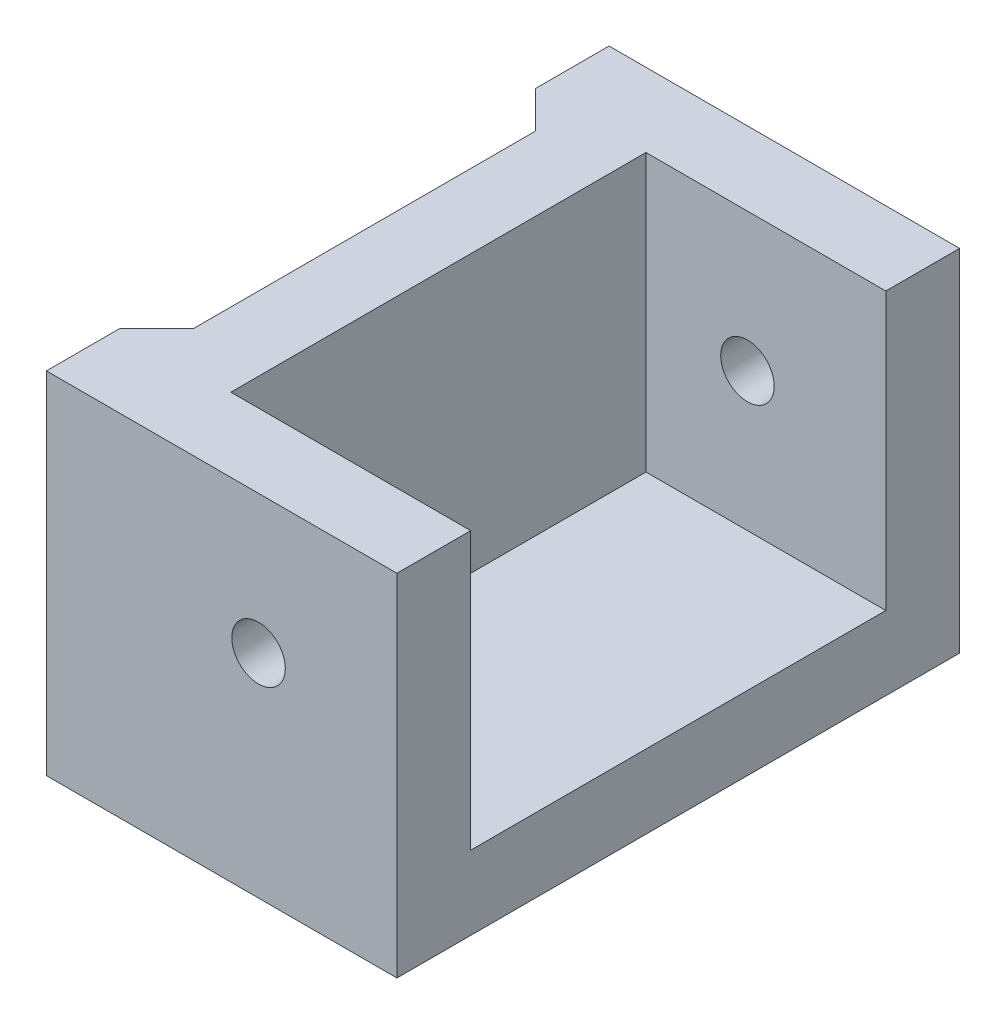
ISO-10303-21;
HEADER;
FILE_DESCRIPTION(('STEP AP214'),'2;1');
FILE_NAME('part.step','',(''),(''),'','','');
FILE_SCHEMA(('AUTOMOTIVE_DESIGN { 1 0 10303 214 1 1 1 1 }'));
ENDSEC;
DATA;
#1=APPLICATION_CONTEXT('core data for automotive mechanical design processes');
#2=APPLICATION_PROTOCOL_DEFINITION('international standard','automotive_design',2000,#1);
#3=PRODUCT_CONTEXT('',#1,'mechanical');
#4=PRODUCT('Part','Part','',(#3));
#5=PRODUCT_RELATED_PRODUCT_CATEGORY('part','',(#4));
#6=PRODUCT_DEFINITION_FORMATION('','',#4);
#7=PRODUCT_DEFINITION_CONTEXT('part definition',#1,'design');
#8=PRODUCT_DEFINITION('design','',#6,#7);
#9=PRODUCT_DEFINITION_SHAPE('','',#8);
#10=(LENGTH_UNIT() NAMED_UNIT(*) SI_UNIT(.MILLI.,.METRE.));
#11=(NAMED_UNIT(*) PLANE_ANGLE_UNIT() SI_UNIT($,.RADIAN.));
#12=(NAMED_UNIT(*) SI_UNIT($,.STERADIAN.) SOLID_ANGLE_UNIT());
#13=UNCERTAINTY_MEASURE_WITH_UNIT(LENGTH_MEASURE(1.E-05),#10,'distance_accuracy_value','');
#14=(GEOMETRIC_REPRESENTATION_CONTEXT(3) GLOBAL_UNCERTAINTY_ASSIGNED_CONTEXT((#13)) GLOBAL_UNIT_ASSIGNED_CONTEXT((#10,
#11,#12)) REPRESENTATION_CONTEXT('',''));
#15=CARTESIAN_POINT('',(0.,0.,0.));
#16=DIRECTION('',(0.,0.,1.));
#17=DIRECTION('',(1.,0.,0.));
#18=AXIS2_PLACEMENT_3D('',#15,#16,#17);
#19=CARTESIAN_POINT('',(5.08,5.08,38.735));
#20=DIRECTION('',(-1.,0.,0.));
#21=DIRECTION('',(0.,0.,1.));
#22=AXIS2_PLACEMENT_3D('',#19,#20,#21);
#23=PLANE('',#22);
#24=DIRECTION('',(0.,-1.,0.));
#25=VECTOR('',#24,1.);
#26=CARTESIAN_POINT('',(5.08,5.08,5.08));
#27=LINE('',#26,#25);
#28=CARTESIAN_POINT('',(5.08,21.59,5.08));
#29=VERTEX_POINT('',#28);
#30=CARTESIAN_POINT('',(5.08,2.54,5.08));
#31=VERTEX_POINT('',#30);
#32=EDGE_CURVE('E122',#29,#31,#27,.T.);
#33=ORIENTED_EDGE('',*,*,#32,.F.);
#34=DIRECTION('',(0.,0.,-1.));
#35=VECTOR('',#34,1.);
#36=CARTESIAN_POINT('',(5.08,21.59,38.735));
#37=LINE('',#36,#35);
#38=CARTESIAN_POINT('',(5.08,21.59,33.655));
#39=VERTEX_POINT('',#38);
#40=EDGE_CURVE('E218',#39,#29,#37,.T.);
#41=ORIENTED_EDGE('',*,*,#40,.F.);
#42=DIRECTION('',(0.,-1.,0.));
#43=VECTOR('',#42,1.);
#44=CARTESIAN_POINT('',(5.08,5.08,33.655));
#45=LINE('',#44,#43);
#46=CARTESIAN_POINT('',(5.08,2.54,33.655));
#47=VERTEX_POINT('',#46);
#48=EDGE_CURVE('E146',#39,#47,#45,.T.);
#49=ORIENTED_EDGE('',*,*,#48,.T.);
#50=DIRECTION('',(0.,0.,-1.));
#51=VECTOR('',#50,1.);
#52=CARTESIAN_POINT('',(5.08,2.54,33.655));
#53=LINE('',#52,#51);
#54=EDGE_CURVE('E140',#47,#31,#53,.T.);
#55=ORIENTED_EDGE('',*,*,#54,.T.);
#56=EDGE_LOOP('',(#33,#41,#49,#55));
#57=FACE_BOUND('',#56,.T.);
#58=ADVANCED_FACE('F33',(#57),#23,.F.);
#59=CARTESIAN_POINT('',(0.,5.08,38.735));
#60=DIRECTION('',(1.,0.,0.));
#61=DIRECTION('',(0.,0.,-1.));
#62=AXIS2_PLACEMENT_3D('',#59,#60,#61);
#63=PLANE('',#62);
#64=DIRECTION('',(0.,0.,1.));
#65=VECTOR('',#64,1.);
#66=CARTESIAN_POINT('',(0.,-2.54,38.735));
#67=LINE('',#66,#65);
#68=CARTESIAN_POINT('',(0.,-2.54,7.62));
#69=VERTEX_POINT('',#68);
#70=CARTESIAN_POINT('',(0.,-2.54,31.115));
#71=VERTEX_POINT('',#70);
#72=EDGE_CURVE('E151',#69,#71,#67,.T.);
#73=ORIENTED_EDGE('',*,*,#72,.T.);
#74=DIRECTION('',(0.,1.,0.));
#75=VECTOR('',#74,1.);
#76=CARTESIAN_POINT('',(0.,5.08,31.115));
#77=LINE('',#76,#75);
#78=CARTESIAN_POINT('',(0.,21.59,31.115));
#79=VERTEX_POINT('',#78);
#80=EDGE_CURVE('E221',#71,#79,#77,.T.);
#81=ORIENTED_EDGE('',*,*,#80,.T.);
#82=DIRECTION('',(0.,0.,-1.));
#83=VECTOR('',#82,1.);
#84=CARTESIAN_POINT('',(0.,21.59,38.735));
#85=LINE('',#84,#83);
#86=CARTESIAN_POINT('',(0.,21.59,7.62));
#87=VERTEX_POINT('',#86);
#88=EDGE_CURVE('E214',#79,#87,#85,.T.);
#89=ORIENTED_EDGE('',*,*,#88,.T.);
#90=DIRECTION('',(0.,-1.,0.));
#91=VECTOR('',#90,1.);
#92=CARTESIAN_POINT('',(0.,-2.54,7.62));
#93=LINE('',#92,#91);
#94=EDGE_CURVE('E55',#87,#69,#93,.T.);
#95=ORIENTED_EDGE('',*,*,#94,.T.);
#96=EDGE_LOOP('',(#73,#81,#89,#95));
#97=FACE_BOUND('',#96,.T.);
#98=ADVANCED_FACE('F232',(#97),#63,.F.);
#99=CARTESIAN_POINT('',(21.59,0.,38.735));
#100=DIRECTION('',(-1.,0.,0.));
#101=DIRECTION('',(0.,0.,1.));
#102=AXIS2_PLACEMENT_3D('',#99,#100,#101);
#103=PLANE('',#102);
#104=DIRECTION('',(0.,-1.,0.));
#105=VECTOR('',#104,1.);
#106=CARTESIAN_POINT('',(21.59,-2.54,5.08));
#107=LINE('',#106,#105);
#108=CARTESIAN_POINT('',(21.59,21.59,5.08));
#109=VERTEX_POINT('',#108);
#110=CARTESIAN_POINT('',(21.59,2.54,5.08));
#111=VERTEX_POINT('',#110);
#112=EDGE_CURVE('E165',#109,#111,#107,.T.);
#113=ORIENTED_EDGE('',*,*,#112,.T.);
#114=DIRECTION('',(0.,0.,-1.));
#115=VECTOR('',#114,1.);
#116=CARTESIAN_POINT('',(21.59,2.54,33.655));
#117=LINE('',#116,#115);
#118=CARTESIAN_POINT('',(21.59,2.54,33.655));
#119=VERTEX_POINT('',#118);
#120=EDGE_CURVE('E143',#119,#111,#117,.T.);
#121=ORIENTED_EDGE('',*,*,#120,.F.);
#122=DIRECTION('',(0.,1.,0.));
#123=VECTOR('',#122,1.);
#124=CARTESIAN_POINT('',(21.59,-2.54,33.655));
#125=LINE('',#124,#123);
#126=CARTESIAN_POINT('',(21.59,21.59,33.655));
#127=VERTEX_POINT('',#126);
#128=EDGE_CURVE('E187',#119,#127,#125,.T.);
#129=ORIENTED_EDGE('',*,*,#128,.T.);
#130=DIRECTION('',(0.,0.,1.));
#131=VECTOR('',#130,1.);
#132=CARTESIAN_POINT('',(21.59,21.59,33.655));
#133=LINE('',#132,#131);
#134=CARTESIAN_POINT('',(21.59,21.59,38.735));
#135=VERTEX_POINT('',#134);
#136=EDGE_CURVE('E200',#127,#135,#133,.T.);
#137=ORIENTED_EDGE('',*,*,#136,.T.);
#138=DIRECTION('',(0.,1.,0.));
#139=VECTOR('',#138,1.);
#140=CARTESIAN_POINT('',(21.59,0.,38.735));
#141=LINE('',#140,#139);
#142=CARTESIAN_POINT('',(21.59,-2.54,38.735));
#143=VERTEX_POINT('',#142);
#144=EDGE_CURVE('E209',#143,#135,#141,.T.);
#145=ORIENTED_EDGE('',*,*,#144,.F.);
#146=DIRECTION('',(0.,0.,1.));
#147=VECTOR('',#146,1.);
#148=CARTESIAN_POINT('',(21.59,-2.54,33.655));
#149=LINE('',#148,#147);
#150=CARTESIAN_POINT('',(21.59,-2.54,0.));
#151=VERTEX_POINT('',#150);
#152=EDGE_CURVE('E203',#151,#143,#149,.T.);
#153=ORIENTED_EDGE('',*,*,#152,.F.);
#154=DIRECTION('',(0.,1.,0.));
#155=VECTOR('',#154,1.);
#156=CARTESIAN_POINT('',(21.59,0.,0.));
#157=LINE('',#156,#155);
#158=CARTESIAN_POINT('',(21.59,21.59,0.));
#159=VERTEX_POINT('',#158);
#160=EDGE_CURVE('E208',#151,#159,#157,.T.);
#161=ORIENTED_EDGE('',*,*,#160,.T.);
#162=DIRECTION('',(0.,0.,-1.));
#163=VECTOR('',#162,1.);
#164=CARTESIAN_POINT('',(21.59,21.59,5.08));
#165=LINE('',#164,#163);
#166=EDGE_CURVE('E173',#109,#159,#165,.T.);
#167=ORIENTED_EDGE('',*,*,#166,.F.);
#168=EDGE_LOOP('',(#113,#121,#129,#137,#145,#153,#161,#167));
#169=FACE_BOUND('',#168,.T.);
#170=ADVANCED_FACE('F249',(#169),#103,.F.);
#171=CARTESIAN_POINT('',(0.,21.59,38.735));
#172=DIRECTION('',(0.,-1.,0.));
#173=DIRECTION('',(0.,0.,-1.));
#174=AXIS2_PLACEMENT_3D('',#171,#172,#173);
#175=PLANE('',#174);
#176=DIRECTION('',(-1.,0.,0.));
#177=VECTOR('',#176,1.);
#178=CARTESIAN_POINT('',(0.,21.59,0.));
#179=LINE('',#178,#177);
#180=CARTESIAN_POINT('',(-2.54,21.59,0.));
#181=VERTEX_POINT('',#180);
#182=EDGE_CURVE('E212',#159,#181,#179,.T.);
#183=ORIENTED_EDGE('',*,*,#182,.T.);
#184=DIRECTION('',(0.,0.,-1.));
#185=VECTOR('',#184,1.);
#186=CARTESIAN_POINT('',(-2.54,21.59,5.08));
#187=LINE('',#186,#185);
#188=CARTESIAN_POINT('',(-2.54,21.59,5.08));
#189=VERTEX_POINT('',#188);
#190=EDGE_CURVE('E167',#189,#181,#187,.T.);
#191=ORIENTED_EDGE('',*,*,#190,.F.);
#192=DIRECTION('',(-0.70710678118655,0.,-0.707106781186545));
#193=VECTOR('',#192,1.);
#194=CARTESIAN_POINT('',(15.5575,21.59,23.1774999999999));
#195=LINE('',#194,#193);
#196=EDGE_CURVE('E41',#189,#87,#195,.F.);
#197=ORIENTED_EDGE('',*,*,#196,.T.);
#198=ORIENTED_EDGE('',*,*,#88,.F.);
#199=DIRECTION('',(-0.707106781186545,0.,0.70710678118655));
#200=VECTOR('',#199,1.);
#201=CARTESIAN_POINT('',(-3.81000000000001,21.59,34.925));
#202=LINE('',#201,#200);
#203=CARTESIAN_POINT('',(-2.54,21.59,33.655));
#204=VERTEX_POINT('',#203);
#205=EDGE_CURVE('E224',#79,#204,#202,.T.);
#206=ORIENTED_EDGE('',*,*,#205,.T.);
#207=DIRECTION('',(0.,0.,1.));
#208=VECTOR('',#207,1.);
#209=CARTESIAN_POINT('',(-2.54,21.59,33.655));
#210=LINE('',#209,#208);
#211=CARTESIAN_POINT('',(-2.54,21.59,38.735));
#212=VERTEX_POINT('',#211);
#213=EDGE_CURVE('E197',#204,#212,#210,.T.);
#214=ORIENTED_EDGE('',*,*,#213,.T.);
#215=DIRECTION('',(-1.,0.,0.));
#216=VECTOR('',#215,1.);
#217=CARTESIAN_POINT('',(0.,21.59,38.735));
#218=LINE('',#217,#216);
#219=EDGE_CURVE('E211',#135,#212,#218,.T.);
#220=ORIENTED_EDGE('',*,*,#219,.F.);
#221=ORIENTED_EDGE('',*,*,#136,.F.);
#222=DIRECTION('',(-1.,0.,0.));
#223=VECTOR('',#222,1.);
#224=CARTESIAN_POINT('',(-2.54,21.59,33.655));
#225=LINE('',#224,#223);
#226=EDGE_CURVE('E190',#127,#39,#225,.T.);
#227=ORIENTED_EDGE('',*,*,#226,.T.);
#228=ORIENTED_EDGE('',*,*,#40,.T.);
#229=DIRECTION('',(1.,0.,0.));
#230=VECTOR('',#229,1.);
#231=CARTESIAN_POINT('',(-2.54,21.59,5.08));
#232=LINE('',#231,#230);
#233=EDGE_CURVE('E128',#29,#109,#232,.T.);
#234=ORIENTED_EDGE('',*,*,#233,.T.);
#235=ORIENTED_EDGE('',*,*,#166,.T.);
#236=EDGE_LOOP('',(#183,#191,#197,#198,#206,#214,#220,#221,#227,#228,#234,#235));
#237=FACE_BOUND('',#236,.T.);
#238=ADVANCED_FACE('F229',(#237),#175,.F.);
#239=CARTESIAN_POINT('',(0.,0.,38.735));
#240=DIRECTION('',(0.,0.,-1.));
#241=DIRECTION('',(-1.,0.,0.));
#242=AXIS2_PLACEMENT_3D('',#239,#240,#241);
#243=PLANE('',#242);
#244=ORIENTED_EDGE('',*,*,#144,.T.);
#245=ORIENTED_EDGE('',*,*,#219,.T.);
#246=DIRECTION('',(0.,-1.,0.));
#247=VECTOR('',#246,1.);
#248=CARTESIAN_POINT('',(-2.54,-2.54,38.735));
#249=LINE('',#248,#247);
#250=CARTESIAN_POINT('',(-2.54,-2.54,38.735));
#251=VERTEX_POINT('',#250);
#252=EDGE_CURVE('E181',#212,#251,#249,.T.);
#253=ORIENTED_EDGE('',*,*,#252,.T.);
#254=DIRECTION('',(1.,0.,0.));
#255=VECTOR('',#254,1.);
#256=CARTESIAN_POINT('',(-2.54,-2.54,38.735));
#257=LINE('',#256,#255);
#258=EDGE_CURVE('E188',#251,#143,#257,.T.);
#259=ORIENTED_EDGE('',*,*,#258,.T.);
#260=EDGE_LOOP('',(#244,#245,#253,#259));
#261=FACE_BOUND('',#260,.T.);
#262=CARTESIAN_POINT('',(12.065,12.065,38.735));
#263=DIRECTION('',(0.,0.,1.));
#264=DIRECTION('',(1.,0.,0.));
#265=AXIS2_PLACEMENT_3D('',#262,#263,#264);
#266=CIRCLE('',#265,1.8415);
#267=CARTESIAN_POINT('',(13.9065,12.065,38.735));
#268=VERTEX_POINT('',#267);
#269=EDGE_CURVE('E133',#268,#268,#266,.T.);
#270=ORIENTED_EDGE('',*,*,#269,.F.);
#271=EDGE_LOOP('',(#270));
#272=FACE_BOUND('',#271,.T.);
#273=ADVANCED_FACE('F254',(#261,#272),#243,.F.);
#274=CARTESIAN_POINT('',(0.,0.,0.));
#275=DIRECTION('',(0.,0.,-1.));
#276=DIRECTION('',(-1.,0.,0.));
#277=AXIS2_PLACEMENT_3D('',#274,#275,#276);
#278=PLANE('',#277);
#279=ORIENTED_EDGE('',*,*,#182,.F.);
#280=ORIENTED_EDGE('',*,*,#160,.F.);
#281=DIRECTION('',(-1.,0.,0.));
#282=VECTOR('',#281,1.);
#283=CARTESIAN_POINT('',(-2.54,-2.54,0.));
#284=LINE('',#283,#282);
#285=CARTESIAN_POINT('',(-2.54,-2.54,0.));
#286=VERTEX_POINT('',#285);
#287=EDGE_CURVE('E163',#151,#286,#284,.T.);
#288=ORIENTED_EDGE('',*,*,#287,.T.);
#289=DIRECTION('',(0.,1.,0.));
#290=VECTOR('',#289,1.);
#291=CARTESIAN_POINT('',(-2.54,-2.54,0.));
#292=LINE('',#291,#290);
#293=EDGE_CURVE('E157',#286,#181,#292,.T.);
#294=ORIENTED_EDGE('',*,*,#293,.T.);
#295=EDGE_LOOP('',(#279,#280,#288,#294));
#296=FACE_BOUND('',#295,.T.);
#297=CARTESIAN_POINT('',(12.065,12.065,0.));
#298=DIRECTION('',(0.,0.,-1.));
#299=DIRECTION('',(-1.,0.,0.));
#300=AXIS2_PLACEMENT_3D('',#297,#298,#299);
#301=CIRCLE('',#300,1.8415);
#302=CARTESIAN_POINT('',(10.2235,12.065,0.));
#303=VERTEX_POINT('',#302);
#304=EDGE_CURVE('E153',#303,#303,#301,.T.);
#305=ORIENTED_EDGE('',*,*,#304,.F.);
#306=EDGE_LOOP('',(#305));
#307=FACE_BOUND('',#306,.T.);
#308=ADVANCED_FACE('F243',(#296,#307),#278,.T.);
#309=CARTESIAN_POINT('',(-2.54,-2.54,33.655));
#310=DIRECTION('',(0.,-1.,0.));
#311=DIRECTION('',(0.,0.,-1.));
#312=AXIS2_PLACEMENT_3D('',#309,#310,#311);
#313=PLANE('',#312);
#314=ORIENTED_EDGE('',*,*,#152,.T.);
#315=ORIENTED_EDGE('',*,*,#258,.F.);
#316=DIRECTION('',(0.,0.,1.));
#317=VECTOR('',#316,1.);
#318=CARTESIAN_POINT('',(-2.54,-2.54,33.655));
#319=LINE('',#318,#317);
#320=CARTESIAN_POINT('',(-2.54,-2.54,33.655));
#321=VERTEX_POINT('',#320);
#322=EDGE_CURVE('E193',#321,#251,#319,.T.);
#323=ORIENTED_EDGE('',*,*,#322,.F.);
#324=DIRECTION('',(0.707106781186545,0.,-0.70710678118655));
#325=VECTOR('',#324,1.);
#326=CARTESIAN_POINT('',(0.,-2.54,31.115));
#327=LINE('',#326,#325);
#328=EDGE_CURVE('E48',#321,#71,#327,.T.);
#329=ORIENTED_EDGE('',*,*,#328,.T.);
#330=ORIENTED_EDGE('',*,*,#72,.F.);
#331=DIRECTION('',(0.70710678118655,0.,0.707106781186545));
#332=VECTOR('',#331,1.);
#333=CARTESIAN_POINT('',(-2.54000000000002,-2.54,5.08));
#334=LINE('',#333,#332);
#335=CARTESIAN_POINT('',(-2.54,-2.54,5.08));
#336=VERTEX_POINT('',#335);
#337=EDGE_CURVE('E11',#69,#336,#334,.F.);
#338=ORIENTED_EDGE('',*,*,#337,.T.);
#339=DIRECTION('',(0.,0.,-1.));
#340=VECTOR('',#339,1.);
#341=CARTESIAN_POINT('',(-2.54,-2.54,5.08));
#342=LINE('',#341,#340);
#343=EDGE_CURVE('E134',#336,#286,#342,.T.);
#344=ORIENTED_EDGE('',*,*,#343,.T.);
#345=ORIENTED_EDGE('',*,*,#287,.F.);
#346=EDGE_LOOP('',(#314,#315,#323,#329,#330,#338,#344,#345));
#347=FACE_BOUND('',#346,.T.);
#348=ADVANCED_FACE('F236',(#347),#313,.T.);
#349=CARTESIAN_POINT('',(-2.54,-2.54,33.655));
#350=DIRECTION('',(-1.,0.,0.));
#351=DIRECTION('',(0.,0.,1.));
#352=AXIS2_PLACEMENT_3D('',#349,#350,#351);
#353=PLANE('',#352);
#354=ORIENTED_EDGE('',*,*,#252,.F.);
#355=ORIENTED_EDGE('',*,*,#213,.F.);
#356=DIRECTION('',(0.,-1.,0.));
#357=VECTOR('',#356,1.);
#358=CARTESIAN_POINT('',(-2.54,-2.54,33.655));
#359=LINE('',#358,#357);
#360=EDGE_CURVE('E184',#204,#321,#359,.T.);
#361=ORIENTED_EDGE('',*,*,#360,.T.);
#362=ORIENTED_EDGE('',*,*,#322,.T.);
#363=EDGE_LOOP('',(#354,#355,#361,#362));
#364=FACE_BOUND('',#363,.T.);
#365=ADVANCED_FACE('F261',(#364),#353,.T.);
#366=CARTESIAN_POINT('',(0.,0.,33.655));
#367=DIRECTION('',(0.,0.,-1.));
#368=DIRECTION('',(-1.,0.,0.));
#369=AXIS2_PLACEMENT_3D('',#366,#367,#368);
#370=PLANE('',#369);
#371=CARTESIAN_POINT('',(12.065,12.065,33.655));
#372=DIRECTION('',(0.,0.,1.));
#373=DIRECTION('',(1.,0.,0.));
#374=AXIS2_PLACEMENT_3D('',#371,#372,#373);
#375=CIRCLE('',#374,1.8415);
#376=CARTESIAN_POINT('',(13.9065,12.065,33.655));
#377=VERTEX_POINT('',#376);
#378=EDGE_CURVE('E178',#377,#377,#375,.T.);
#379=ORIENTED_EDGE('',*,*,#378,.T.);
#380=EDGE_LOOP('',(#379));
#381=FACE_BOUND('',#380,.T.);
#382=ORIENTED_EDGE('',*,*,#128,.F.);
#383=DIRECTION('',(1.,0.,0.));
#384=VECTOR('',#383,1.);
#385=CARTESIAN_POINT('',(-23.6076667751143,2.54,33.655));
#386=LINE('',#385,#384);
#387=EDGE_CURVE('E144',#47,#119,#386,.T.);
#388=ORIENTED_EDGE('',*,*,#387,.F.);
#389=ORIENTED_EDGE('',*,*,#48,.F.);
#390=ORIENTED_EDGE('',*,*,#226,.F.);
#391=EDGE_LOOP('',(#382,#388,#389,#390));
#392=FACE_BOUND('',#391,.T.);
#393=ADVANCED_FACE('F294',(#381,#392),#370,.T.);
#394=CARTESIAN_POINT('',(12.065,12.065,33.655));
#395=DIRECTION('',(0.,0.,1.));
#396=DIRECTION('',(1.,0.,0.));
#397=AXIS2_PLACEMENT_3D('',#394,#395,#396);
#398=CYLINDRICAL_SURFACE('',#397,1.8415);
#399=ORIENTED_EDGE('',*,*,#378,.F.);
#400=EDGE_LOOP('',(#399));
#401=FACE_BOUND('',#400,.T.);
#402=ORIENTED_EDGE('',*,*,#269,.T.);
#403=EDGE_LOOP('',(#402));
#404=FACE_BOUND('',#403,.T.);
#405=ADVANCED_FACE('F299',(#401,#404),#398,.F.);
#406=CARTESIAN_POINT('',(-2.54,-2.54,5.08));
#407=DIRECTION('',(-1.,0.,0.));
#408=DIRECTION('',(0.,0.,1.));
#409=AXIS2_PLACEMENT_3D('',#406,#407,#408);
#410=PLANE('',#409);
#411=ORIENTED_EDGE('',*,*,#293,.F.);
#412=ORIENTED_EDGE('',*,*,#343,.F.);
#413=DIRECTION('',(0.,1.,0.));
#414=VECTOR('',#413,1.);
#415=CARTESIAN_POINT('',(-2.54,-2.54,5.08));
#416=LINE('',#415,#414);
#417=EDGE_CURVE('E160',#336,#189,#416,.T.);
#418=ORIENTED_EDGE('',*,*,#417,.T.);
#419=ORIENTED_EDGE('',*,*,#190,.T.);
#420=EDGE_LOOP('',(#411,#412,#418,#419));
#421=FACE_BOUND('',#420,.T.);
#422=ADVANCED_FACE('F240',(#421),#410,.T.);
#423=CARTESIAN_POINT('',(0.,0.,5.08));
#424=DIRECTION('',(0.,0.,-1.));
#425=DIRECTION('',(-1.,0.,0.));
#426=AXIS2_PLACEMENT_3D('',#423,#424,#425);
#427=PLANE('',#426);
#428=CARTESIAN_POINT('',(12.065,12.065,5.08));
#429=DIRECTION('',(0.,0.,-1.));
#430=DIRECTION('',(-1.,0.,0.));
#431=AXIS2_PLACEMENT_3D('',#428,#429,#430);
#432=CIRCLE('',#431,1.8415);
#433=CARTESIAN_POINT('',(10.2235,12.065,5.08));
#434=VERTEX_POINT('',#433);
#435=EDGE_CURVE('E154',#434,#434,#432,.T.);
#436=ORIENTED_EDGE('',*,*,#435,.T.);
#437=EDGE_LOOP('',(#436));
#438=FACE_BOUND('',#437,.T.);
#439=ORIENTED_EDGE('',*,*,#32,.T.);
#440=DIRECTION('',(1.,0.,0.));
#441=VECTOR('',#440,1.);
#442=CARTESIAN_POINT('',(-23.6076667751143,2.54,5.08));
#443=LINE('',#442,#441);
#444=EDGE_CURVE('E126',#31,#111,#443,.T.);
#445=ORIENTED_EDGE('',*,*,#444,.T.);
#446=ORIENTED_EDGE('',*,*,#112,.F.);
#447=ORIENTED_EDGE('',*,*,#233,.F.);
#448=EDGE_LOOP('',(#439,#445,#446,#447));
#449=FACE_BOUND('',#448,.T.);
#450=ADVANCED_FACE('F124',(#438,#449),#427,.F.);
#451=CARTESIAN_POINT('',(12.065,12.065,5.08));
#452=DIRECTION('',(0.,0.,-1.));
#453=DIRECTION('',(-1.,0.,0.));
#454=AXIS2_PLACEMENT_3D('',#451,#452,#453);
#455=CYLINDRICAL_SURFACE('',#454,1.8415);
#456=ORIENTED_EDGE('',*,*,#435,.F.);
#457=EDGE_LOOP('',(#456));
#458=FACE_BOUND('',#457,.T.);
#459=ORIENTED_EDGE('',*,*,#304,.T.);
#460=EDGE_LOOP('',(#459));
#461=FACE_BOUND('',#460,.T.);
#462=ADVANCED_FACE('F269',(#458,#461),#455,.F.);
#463=CARTESIAN_POINT('',(-23.6076667751143,2.54,33.655));
#464=DIRECTION('',(0.,-1.,0.));
#465=DIRECTION('',(0.,0.,-1.));
#466=AXIS2_PLACEMENT_3D('',#463,#464,#465);
#467=PLANE('',#466);
#468=ORIENTED_EDGE('',*,*,#387,.T.);
#469=ORIENTED_EDGE('',*,*,#120,.T.);
#470=ORIENTED_EDGE('',*,*,#444,.F.);
#471=ORIENTED_EDGE('',*,*,#54,.F.);
#472=EDGE_LOOP('',(#468,#469,#470,#471));
#473=FACE_BOUND('',#472,.T.);
#474=ADVANCED_FACE('F139',(#473),#467,.F.);
#475=CARTESIAN_POINT('',(0.,5.08,31.115));
#476=DIRECTION('',(0.70710678118655,0.,0.707106781186545));
#477=DIRECTION('',(0.,1.,0.));
#478=AXIS2_PLACEMENT_3D('',#475,#476,#477);
#479=PLANE('',#478);
#480=ORIENTED_EDGE('',*,*,#328,.F.);
#481=ORIENTED_EDGE('',*,*,#360,.F.);
#482=ORIENTED_EDGE('',*,*,#205,.F.);
#483=ORIENTED_EDGE('',*,*,#80,.F.);
#484=EDGE_LOOP('',(#480,#481,#482,#483));
#485=FACE_BOUND('',#484,.T.);
#486=ADVANCED_FACE('F263',(#485),#479,.F.);
#487=CARTESIAN_POINT('',(-2.54000000000002,0.,5.08));
#488=DIRECTION('',(-0.707106781186545,0.,0.70710678118655));
#489=DIRECTION('',(0.,-1.,0.));
#490=AXIS2_PLACEMENT_3D('',#487,#488,#489);
#491=PLANE('',#490);
#492=ORIENTED_EDGE('',*,*,#337,.F.);
#493=ORIENTED_EDGE('',*,*,#94,.F.);
#494=ORIENTED_EDGE('',*,*,#196,.F.);
#495=ORIENTED_EDGE('',*,*,#417,.F.);
#496=EDGE_LOOP('',(#492,#493,#494,#495));
#497=FACE_BOUND('',#496,.T.);
#498=ADVANCED_FACE('F35',(#497),#491,.T.);
#499=CLOSED_SHELL('',(#58,#98,#170,#238,#273,#308,#348,#365,#393,#405,#422,#450,#462,#474,#486,#498));
#500=MANIFOLD_SOLID_BREP('B2',#499);
#501=ADVANCED_BREP_SHAPE_REPRESENTATION('',(#18,#500),#14);
#502=SHAPE_DEFINITION_REPRESENTATION(#9,#501);
ENDSEC;
END-ISO-10303-21;
